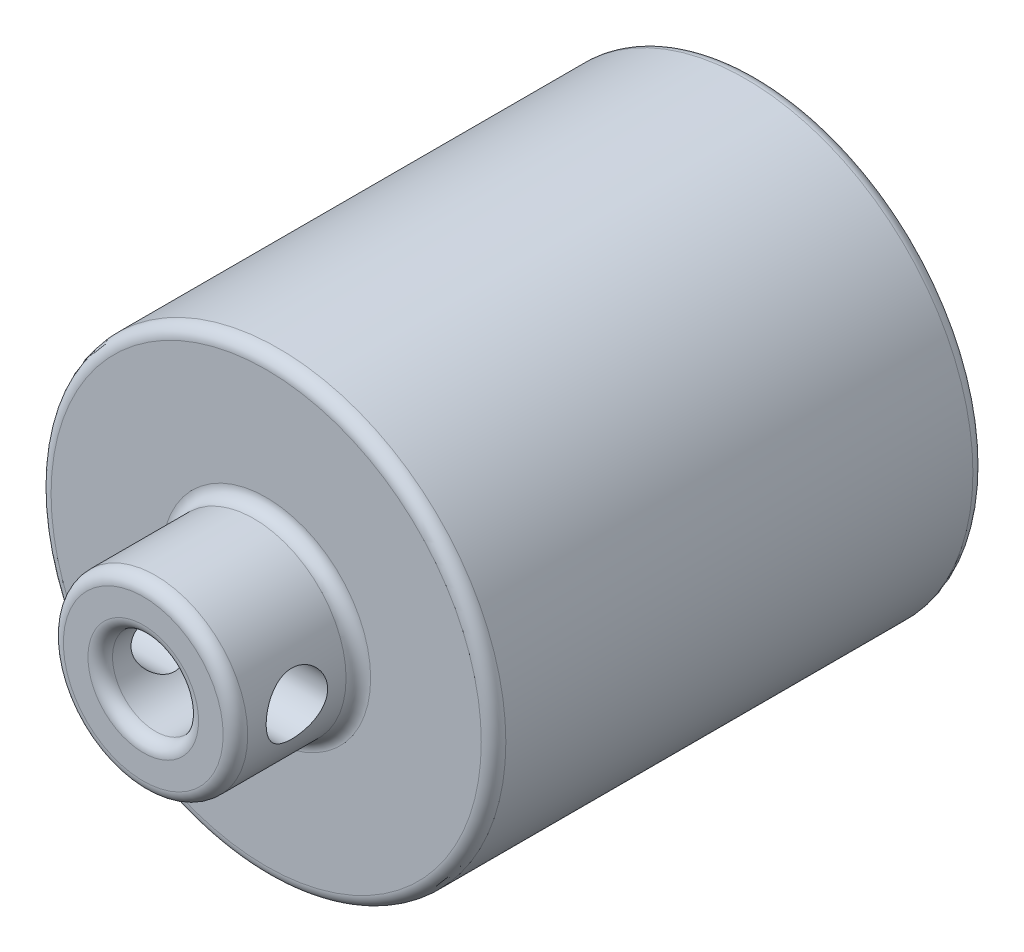
ISO-10303-21;
HEADER;
FILE_DESCRIPTION(('STEP AP214'),'2;1');
FILE_NAME('part.step','',(''),(''),'','','');
FILE_SCHEMA(('AUTOMOTIVE_DESIGN { 1 0 10303 214 1 1 1 1 }'));
ENDSEC;
DATA;
#1=APPLICATION_CONTEXT('core data for automotive mechanical design processes');
#2=APPLICATION_PROTOCOL_DEFINITION('international standard','automotive_design',2000,#1);
#3=PRODUCT_CONTEXT('',#1,'mechanical');
#4=PRODUCT('Part','Part','',(#3));
#5=PRODUCT_RELATED_PRODUCT_CATEGORY('part','',(#4));
#6=PRODUCT_DEFINITION_FORMATION('','',#4);
#7=PRODUCT_DEFINITION_CONTEXT('part definition',#1,'design');
#8=PRODUCT_DEFINITION('design','',#6,#7);
#9=PRODUCT_DEFINITION_SHAPE('','',#8);
#10=(LENGTH_UNIT() NAMED_UNIT(*) SI_UNIT(.MILLI.,.METRE.));
#11=(NAMED_UNIT(*) PLANE_ANGLE_UNIT() SI_UNIT($,.RADIAN.));
#12=(NAMED_UNIT(*) SI_UNIT($,.STERADIAN.) SOLID_ANGLE_UNIT());
#13=UNCERTAINTY_MEASURE_WITH_UNIT(LENGTH_MEASURE(1.E-05),#10,'distance_accuracy_value','');
#14=(GEOMETRIC_REPRESENTATION_CONTEXT(3) GLOBAL_UNCERTAINTY_ASSIGNED_CONTEXT((#13)) GLOBAL_UNIT_ASSIGNED_CONTEXT((#10,
#11,#12)) REPRESENTATION_CONTEXT('',''));
#15=CARTESIAN_POINT('',(0.,0.,0.));
#16=DIRECTION('',(0.,0.,1.));
#17=DIRECTION('',(1.,0.,0.));
#18=AXIS2_PLACEMENT_3D('',#15,#16,#17);
#19=CARTESIAN_POINT('',(0.,0.,40.));
#20=DIRECTION('',(0.,0.,-1.));
#21=DIRECTION('',(-1.,0.,0.));
#22=AXIS2_PLACEMENT_3D('',#19,#20,#21);
#23=CYLINDRICAL_SURFACE('',#22,18.5);
#24=CARTESIAN_POINT('',(0.,0.,1.));
#25=DIRECTION('',(0.,0.,1.));
#26=DIRECTION('',(1.,0.,0.));
#27=AXIS2_PLACEMENT_3D('',#24,#25,#26);
#28=CIRCLE('',#27,18.5);
#29=CARTESIAN_POINT('',(18.5,0.,1.));
#30=VERTEX_POINT('',#29);
#31=EDGE_CURVE('E141',#30,#30,#28,.T.);
#32=ORIENTED_EDGE('',*,*,#31,.T.);
#33=EDGE_LOOP('',(#32));
#34=FACE_BOUND('',#33,.T.);
#35=CARTESIAN_POINT('',(0.,0.,39.));
#36=DIRECTION('',(0.,0.,1.));
#37=DIRECTION('',(1.,0.,0.));
#38=AXIS2_PLACEMENT_3D('',#35,#36,#37);
#39=CIRCLE('',#38,18.5);
#40=CARTESIAN_POINT('',(18.5,0.,39.));
#41=VERTEX_POINT('',#40);
#42=EDGE_CURVE('E154',#41,#41,#39,.F.);
#43=ORIENTED_EDGE('',*,*,#42,.T.);
#44=EDGE_LOOP('',(#43));
#45=FACE_BOUND('',#44,.T.);
#46=ADVANCED_FACE('F43',(#34,#45),#23,.T.);
#47=CARTESIAN_POINT('',(0.,0.,40.));
#48=DIRECTION('',(0.,0.,1.));
#49=DIRECTION('',(1.,0.,0.));
#50=AXIS2_PLACEMENT_3D('',#47,#48,#49);
#51=PLANE('',#50);
#52=CARTESIAN_POINT('',(0.,0.,40.));
#53=DIRECTION('',(0.,0.,1.));
#54=DIRECTION('',(1.,0.,0.));
#55=AXIS2_PLACEMENT_3D('',#52,#53,#54);
#56=CIRCLE('',#55,8.5);
#57=CARTESIAN_POINT('',(8.5,0.,40.));
#58=VERTEX_POINT('',#57);
#59=EDGE_CURVE('E143',#58,#58,#56,.F.);
#60=ORIENTED_EDGE('',*,*,#59,.T.);
#61=EDGE_LOOP('',(#60));
#62=FACE_BOUND('',#61,.T.);
#63=CARTESIAN_POINT('',(0.,0.,40.));
#64=DIRECTION('',(0.,0.,1.));
#65=DIRECTION('',(1.,0.,0.));
#66=AXIS2_PLACEMENT_3D('',#63,#64,#65);
#67=CIRCLE('',#66,17.5);
#68=CARTESIAN_POINT('',(17.5,0.,40.));
#69=VERTEX_POINT('',#68);
#70=EDGE_CURVE('E158',#69,#69,#67,.T.);
#71=ORIENTED_EDGE('',*,*,#70,.T.);
#72=EDGE_LOOP('',(#71));
#73=FACE_BOUND('',#72,.T.);
#74=ADVANCED_FACE('F106',(#62,#73),#51,.T.);
#75=CARTESIAN_POINT('',(0.,0.,0.));
#76=DIRECTION('',(0.,0.,1.));
#77=DIRECTION('',(1.,0.,0.));
#78=AXIS2_PLACEMENT_3D('',#75,#76,#77);
#79=PLANE('',#78);
#80=CARTESIAN_POINT('',(0.,0.,0.));
#81=DIRECTION('',(0.,0.,1.));
#82=DIRECTION('',(1.,0.,0.));
#83=AXIS2_PLACEMENT_3D('',#80,#81,#82);
#84=CIRCLE('',#83,17.5);
#85=CARTESIAN_POINT('',(17.5,0.,0.));
#86=VERTEX_POINT('',#85);
#87=EDGE_CURVE('E63',#86,#86,#84,.F.);
#88=ORIENTED_EDGE('',*,*,#87,.T.);
#89=EDGE_LOOP('',(#88));
#90=FACE_BOUND('',#89,.T.);
#91=ADVANCED_FACE('F104',(#90),#79,.F.);
#92=CARTESIAN_POINT('',(0.,0.,50.));
#93=DIRECTION('',(0.,0.,-1.));
#94=DIRECTION('',(-1.,0.,0.));
#95=AXIS2_PLACEMENT_3D('',#92,#93,#94);
#96=CYLINDRICAL_SURFACE('',#95,7.5);
#97=CARTESIAN_POINT('',(-7.5,0.,47.5));
#98=CARTESIAN_POINT('',(-7.5000003825236,-0.136408407216808,47.5000006343291));
#99=CARTESIAN_POINT('',(-7.49624423768862,-0.272812986346374,47.488799334682));
#100=CARTESIAN_POINT('',(-7.48163025508202,-0.54160440218243,47.444427227957));
#101=CARTESIAN_POINT('',(-7.47077168005381,-0.673990820297045,47.4112541401277));
#102=CARTESIAN_POINT('',(-7.44313269766107,-0.93083197375444,47.3242018915399));
#103=CARTESIAN_POINT('',(-7.42636219327133,-1.05529956471509,47.2703573438518));
#104=CARTESIAN_POINT('',(-7.38861114293354,-1.29343734201331,47.1436470679041));
#105=CARTESIAN_POINT('',(-7.36762976669445,-1.40710539239676,47.0707775874935));
#106=CARTESIAN_POINT('',(-7.32285236107512,-1.62435418755567,46.9054354878531));
#107=CARTESIAN_POINT('',(-7.29898891159462,-1.72750925074578,46.8124219143488));
#108=CARTESIAN_POINT('',(-7.25150786957803,-1.91708173175521,46.6105821132336));
#109=CARTESIAN_POINT('',(-7.22789033226373,-2.00349546372366,46.5017524126787));
#110=CARTESIAN_POINT('',(-7.18283331193184,-2.15956235556965,46.2675372120089));
#111=CARTESIAN_POINT('',(-7.1614759818922,-2.22866214555258,46.1417656506697));
#112=CARTESIAN_POINT('',(-7.12438263546503,-2.3445471846943,45.8795597638536));
#113=CARTESIAN_POINT('',(-7.10864490401864,-2.39133924346691,45.7431287070931));
#114=CARTESIAN_POINT('',(-7.08528258173443,-2.45968365377291,45.4683169462582));
#115=CARTESIAN_POINT('',(-7.07740239424028,-2.48203362067942,45.3301569787773));
#116=CARTESIAN_POINT('',(-7.06989141573769,-2.5033528083362,45.0518406146103));
#117=CARTESIAN_POINT('',(-7.07025807556825,-2.5023292540118,44.911684848227));
#118=CARTESIAN_POINT('',(-7.0789753752045,-2.47754975925855,44.6401584238899));
#119=CARTESIAN_POINT('',(-7.08696039668832,-2.45483478291749,44.5086789927024));
#120=CARTESIAN_POINT('',(-7.10941644311377,-2.38901540712355,44.2515164509829));
#121=CARTESIAN_POINT('',(-7.12388824460269,-2.34590856647968,44.1258340364123));
#122=CARTESIAN_POINT('',(-7.15794777828122,-2.23984764515053,43.8814681260213));
#123=CARTESIAN_POINT('',(-7.17761414482793,-2.17658512176816,43.7629299363262));
#124=CARTESIAN_POINT('',(-7.21981396439316,-2.03222276575785,43.5378227293007));
#125=CARTESIAN_POINT('',(-7.24234824476159,-1.95111778091002,43.4312571826665));
#126=CARTESIAN_POINT('',(-7.28918322919352,-1.7683733317056,43.2272710045981));
#127=CARTESIAN_POINT('',(-7.31351473387107,-1.66588287519078,43.1306182637273));
#128=CARTESIAN_POINT('',(-7.36017345967592,-1.44584892492516,42.9556718333415));
#129=CARTESIAN_POINT('',(-7.38250048845168,-1.32830398915204,42.8773799045888));
#130=CARTESIAN_POINT('',(-7.42292769844484,-1.07986903261567,42.7407592494123));
#131=CARTESIAN_POINT('',(-7.44098375020098,-0.948858191040846,42.6826362716482));
#132=CARTESIAN_POINT('',(-7.47051417861087,-0.678172708411274,42.5894920651107));
#133=CARTESIAN_POINT('',(-7.48199084137198,-0.538501095387388,42.5544628114414));
#134=CARTESIAN_POINT('',(-7.49669067678601,-0.260959573823264,42.5098608349441));
#135=CARTESIAN_POINT('',(-7.5002500458432,-0.123273999662119,42.4992504770681));
#136=CARTESIAN_POINT('',(-7.49972256737068,0.15193767490059,42.5008316839962));
#137=CARTESIAN_POINT('',(-7.49563701048406,0.289463798299123,42.5130193999497));
#138=CARTESIAN_POINT('',(-7.48050061792761,0.556299665760637,42.5590297693399));
#139=CARTESIAN_POINT('',(-7.46965496777981,0.685732017087108,42.5922155151237));
#140=CARTESIAN_POINT('',(-7.44229617075175,0.937139896448933,42.6784836111668));
#141=CARTESIAN_POINT('',(-7.42578230116688,1.05911447127151,42.7315684986695));
#142=CARTESIAN_POINT('',(-7.38822328218224,1.29572074098318,42.857676079602));
#143=CARTESIAN_POINT('',(-7.36707036889465,1.41007489804287,42.9311864832079));
#144=CARTESIAN_POINT('',(-7.32263134790656,1.62516207533897,43.0954853750337));
#145=CARTESIAN_POINT('',(-7.29934458984569,1.72589091948894,43.1862791400794));
#146=CARTESIAN_POINT('',(-7.25192119951112,1.91563126951575,43.3874468775165));
#147=CARTESIAN_POINT('',(-7.2277940271857,2.00390242311443,43.4985230673172));
#148=CARTESIAN_POINT('',(-7.18249933236772,2.16064380580894,43.7344289195272));
#149=CARTESIAN_POINT('',(-7.16133183455006,2.22911386982754,43.8592586965852));
#150=CARTESIAN_POINT('',(-7.12455979478459,2.3439923260409,44.1191825382247));
#151=CARTESIAN_POINT('',(-7.10894401982447,2.39044533041255,44.2542551979219));
#152=CARTESIAN_POINT('',(-7.08527080766124,2.45973666689839,44.5309466251103));
#153=CARTESIAN_POINT('',(-7.07720996559098,2.48258563738485,44.6725624135109));
#154=CARTESIAN_POINT('',(-7.06994647185443,2.50319070619336,44.9504927401023));
#155=CARTESIAN_POINT('',(-7.07031000643538,2.502175643271,45.0867058507171));
#156=CARTESIAN_POINT('',(-7.07878174559668,2.47810573362174,45.3569126873052));
#157=CARTESIAN_POINT('',(-7.08688948923404,2.45505219864647,45.4909065448877));
#158=CARTESIAN_POINT('',(-7.10961310762229,2.38842953282336,45.7503391575062));
#159=CARTESIAN_POINT('',(-7.12410245056194,2.34525836503879,45.8758920625112));
#160=CARTESIAN_POINT('',(-7.15790997046171,2.23994841439937,46.1180685173457));
#161=CARTESIAN_POINT('',(-7.17722921908483,2.17780542138452,46.23469007797));
#162=CARTESIAN_POINT('',(-7.21957073065115,2.03315173145858,46.4612091748073));
#163=CARTESIAN_POINT('',(-7.24271779105343,1.94987060691145,46.570591254746));
#164=CARTESIAN_POINT('',(-7.28958390708132,1.76660720783912,46.7742245334605));
#165=CARTESIAN_POINT('',(-7.31330312280931,1.66662021112871,46.8684714392202));
#166=CARTESIAN_POINT('',(-7.3597507631386,1.44810389230173,47.0428610307229));
#167=CARTESIAN_POINT('',(-7.38240454503142,1.32900378374932,47.1223108693775));
#168=CARTESIAN_POINT('',(-7.4231497793153,1.07839339351656,47.2599760721266));
#169=CARTESIAN_POINT('',(-7.44124239769824,0.946886295330872,47.3181968648051));
#170=CARTESIAN_POINT('',(-7.47013787671354,0.681234118002439,47.4093040812217));
#171=CARTESIAN_POINT('',(-7.48123031056307,0.547469394191021,47.4432061656584));
#172=CARTESIAN_POINT('',(-7.49616017660555,0.275801040025617,47.4885507016928));
#173=CARTESIAN_POINT('',(-7.49999961329762,0.137898563921866,47.4999993587413));
#174=CARTESIAN_POINT('',(-7.5,0.,47.5));
#175=B_SPLINE_CURVE_WITH_KNOTS('',3,(#97,#98,#99,#100,#101,#102,#103,#104,#105,#106,#107,#108,
#109,#110,#111,#112,#113,#114,#115,#116,#117,#118,#119,#120,#121,#122,#123,#124,#125,#126,#127,
#128,#129,#130,#131,#132,#133,#134,#135,#136,#137,#138,#139,#140,#141,#142,#143,#144,#145,#146,
#147,#148,#149,#150,#151,#152,#153,#154,#155,#156,#157,#158,#159,#160,#161,#162,#163,#164,#165,
#166,#167,#168,#169,#170,#171,#172,#173,#174),.UNSPECIFIED.,.T.,.F.,(4,2,2,2,2,2,2,2,2,2,2,2,2,
2,2,2,2,2,2,2,2,2,2,2,2,2,2,2,2,2,2,2,2,2,2,2,2,2,4),(0.,0.408717765065027,0.817477963168801,
1.22555668217569,1.63371594449775,2.0546171070689,2.47561083218826,2.90870962058676,
3.34167611732083,3.760048143546,4.17829084968714,4.57742066378201,4.97659827138705,
5.38220427887826,5.78792756395518,6.21483264528417,6.64177864916546,7.07296014125894,
7.50399172193021,7.91633957937924,8.32861782910442,8.72895394945534,9.1293411321026,
9.54025999609342,9.95130452054729,10.3810255720188,10.8107502058749,11.2396003456693,
11.668257117646,12.0748916516065,12.4815019837844,12.8803896770104,13.2793659543994,
13.6957516672951,14.1122552780945,14.5449915208775,14.9776170288114,15.3909139593454,
15.8040966509535),.UNSPECIFIED.);
#176=CARTESIAN_POINT('',(-7.5,0.,47.5));
#177=VERTEX_POINT('',#176);
#178=EDGE_CURVE('E94',#177,#177,#175,.T.);
#179=ORIENTED_EDGE('',*,*,#178,.T.);
#180=EDGE_LOOP('',(#179));
#181=FACE_BOUND('',#180,.T.);
#182=CARTESIAN_POINT('',(7.5,0.,42.5));
#183=CARTESIAN_POINT('',(7.5000003825236,-0.136408407216808,42.4999993656709));
#184=CARTESIAN_POINT('',(7.49624423768862,-0.272812986346374,42.511200665318));
#185=CARTESIAN_POINT('',(7.48163025508202,-0.54160440218243,42.555572772043));
#186=CARTESIAN_POINT('',(7.47077168005381,-0.673990820297045,42.5887458598723));
#187=CARTESIAN_POINT('',(7.44313269766107,-0.93083197375444,42.6757981084601));
#188=CARTESIAN_POINT('',(7.42636219327133,-1.05529956471509,42.7296426561482));
#189=CARTESIAN_POINT('',(7.38861114293354,-1.29343734201331,42.8563529320959));
#190=CARTESIAN_POINT('',(7.36762976669445,-1.40710539239676,42.9292224125065));
#191=CARTESIAN_POINT('',(7.32285236107512,-1.62435418755567,43.0945645121469));
#192=CARTESIAN_POINT('',(7.29898891159462,-1.72750925074578,43.1875780856512));
#193=CARTESIAN_POINT('',(7.25150786957803,-1.91708173175521,43.3894178867664));
#194=CARTESIAN_POINT('',(7.22789033226373,-2.00349546372366,43.4982475873213));
#195=CARTESIAN_POINT('',(7.18283331193184,-2.15956235556965,43.7324627879911));
#196=CARTESIAN_POINT('',(7.1614759818922,-2.22866214555258,43.8582343493303));
#197=CARTESIAN_POINT('',(7.12438263546503,-2.3445471846943,44.1204402361464));
#198=CARTESIAN_POINT('',(7.10864490401864,-2.39133924346691,44.2568712929069));
#199=CARTESIAN_POINT('',(7.08528258173443,-2.45968365377291,44.5316830537418));
#200=CARTESIAN_POINT('',(7.07740239424028,-2.48203362067943,44.6698430212227));
#201=CARTESIAN_POINT('',(7.06989141573769,-2.5033528083362,44.9481593853897));
#202=CARTESIAN_POINT('',(7.07025807556825,-2.5023292540118,45.088315151773));
#203=CARTESIAN_POINT('',(7.0789753752045,-2.47754975925855,45.3598415761101));
#204=CARTESIAN_POINT('',(7.08696039668832,-2.45483478291749,45.4913210072975));
#205=CARTESIAN_POINT('',(7.10941644311377,-2.38901540712355,45.7484835490171));
#206=CARTESIAN_POINT('',(7.12388824460269,-2.34590856647968,45.8741659635877));
#207=CARTESIAN_POINT('',(7.15794777828122,-2.23984764515053,46.1185318739787));
#208=CARTESIAN_POINT('',(7.17761414482793,-2.17658512176816,46.2370700636738));
#209=CARTESIAN_POINT('',(7.21981396439316,-2.03222276575785,46.4621772706993));
#210=CARTESIAN_POINT('',(7.24234824476159,-1.95111778091002,46.5687428173334));
#211=CARTESIAN_POINT('',(7.28918322919352,-1.7683733317056,46.7727289954019));
#212=CARTESIAN_POINT('',(7.31351473387107,-1.66588287519078,46.8693817362727));
#213=CARTESIAN_POINT('',(7.36017345967592,-1.44584892492516,47.0443281666585));
#214=CARTESIAN_POINT('',(7.38250048845168,-1.32830398915204,47.1226200954112));
#215=CARTESIAN_POINT('',(7.42292769844484,-1.07986903261567,47.2592407505877));
#216=CARTESIAN_POINT('',(7.44098375020098,-0.948858191040846,47.3173637283518));
#217=CARTESIAN_POINT('',(7.47051417861087,-0.678172708411274,47.4105079348893));
#218=CARTESIAN_POINT('',(7.48199084137198,-0.538501095387388,47.4455371885586));
#219=CARTESIAN_POINT('',(7.49669067678601,-0.260959573823264,47.4901391650559));
#220=CARTESIAN_POINT('',(7.5002500458432,-0.123273999662119,47.5007495229319));
#221=CARTESIAN_POINT('',(7.49972256737068,0.15193767490059,47.4991683160038));
#222=CARTESIAN_POINT('',(7.49563701048406,0.289463798299123,47.4869806000503));
#223=CARTESIAN_POINT('',(7.48050061792761,0.556299665760637,47.4409702306601));
#224=CARTESIAN_POINT('',(7.46965496777981,0.685732017087108,47.4077844848763));
#225=CARTESIAN_POINT('',(7.44229617075175,0.937139896448933,47.3215163888332));
#226=CARTESIAN_POINT('',(7.42578230116688,1.05911447127151,47.2684315013305));
#227=CARTESIAN_POINT('',(7.38822328218224,1.29572074098318,47.142323920398));
#228=CARTESIAN_POINT('',(7.36707036889465,1.41007489804287,47.0688135167921));
#229=CARTESIAN_POINT('',(7.32263134790656,1.62516207533897,46.9045146249663));
#230=CARTESIAN_POINT('',(7.29934458984569,1.72589091948894,46.8137208599206));
#231=CARTESIAN_POINT('',(7.25192119951112,1.91563126951575,46.6125531224835));
#232=CARTESIAN_POINT('',(7.2277940271857,2.00390242311443,46.5014769326828));
#233=CARTESIAN_POINT('',(7.18249933236772,2.16064380580894,46.2655710804728));
#234=CARTESIAN_POINT('',(7.16133183455006,2.22911386982754,46.1407413034148));
#235=CARTESIAN_POINT('',(7.12455979478459,2.34399232604091,45.8808174617753));
#236=CARTESIAN_POINT('',(7.10894401982447,2.39044533041255,45.7457448020781));
#237=CARTESIAN_POINT('',(7.08527080766124,2.45973666689839,45.4690533748897));
#238=CARTESIAN_POINT('',(7.07720996559098,2.48258563738485,45.3274375864891));
#239=CARTESIAN_POINT('',(7.06994647185443,2.50319070619336,45.0495072598977));
#240=CARTESIAN_POINT('',(7.07031000643538,2.502175643271,44.9132941492829));
#241=CARTESIAN_POINT('',(7.07878174559668,2.47810573362174,44.6430873126948));
#242=CARTESIAN_POINT('',(7.08688948923404,2.45505219864647,44.5090934551123));
#243=CARTESIAN_POINT('',(7.10961310762229,2.38842953282336,44.2496608424938));
#244=CARTESIAN_POINT('',(7.12410245056194,2.34525836503879,44.1241079374888));
#245=CARTESIAN_POINT('',(7.15790997046171,2.23994841439937,43.8819314826543));
#246=CARTESIAN_POINT('',(7.17722921908483,2.17780542138452,43.76530992203));
#247=CARTESIAN_POINT('',(7.21957073065115,2.03315173145858,43.5387908251927));
#248=CARTESIAN_POINT('',(7.24271779105342,1.94987060691146,43.429408745254));
#249=CARTESIAN_POINT('',(7.28958390708132,1.76660720783913,43.2257754665395));
#250=CARTESIAN_POINT('',(7.3133031228093,1.66662021112871,43.1315285607798));
#251=CARTESIAN_POINT('',(7.3597507631386,1.44810389230173,42.9571389692771));
#252=CARTESIAN_POINT('',(7.38240454503142,1.32900378374932,42.8776891306225));
#253=CARTESIAN_POINT('',(7.4231497793153,1.07839339351656,42.7400239278734));
#254=CARTESIAN_POINT('',(7.44124239769824,0.946886295330872,42.6818031351949));
#255=CARTESIAN_POINT('',(7.47013787671354,0.681234118002439,42.5906959187783));
#256=CARTESIAN_POINT('',(7.48123031056307,0.547469394191021,42.5567938343415));
#257=CARTESIAN_POINT('',(7.49616017660555,0.275801040025617,42.5114492983072));
#258=CARTESIAN_POINT('',(7.49999961329762,0.137898563921866,42.5000006412587));
#259=CARTESIAN_POINT('',(7.5,0.,42.5));
#260=B_SPLINE_CURVE_WITH_KNOTS('',3,(#182,#183,#184,#185,#186,#187,#188,#189,#190,#191,#192,
#193,#194,#195,#196,#197,#198,#199,#200,#201,#202,#203,#204,#205,#206,#207,#208,#209,#210,#211,
#212,#213,#214,#215,#216,#217,#218,#219,#220,#221,#222,#223,#224,#225,#226,#227,#228,#229,#230,
#231,#232,#233,#234,#235,#236,#237,#238,#239,#240,#241,#242,#243,#244,#245,#246,#247,#248,#249,
#250,#251,#252,#253,#254,#255,#256,#257,#258,#259),.UNSPECIFIED.,.T.,.F.,(4,2,2,2,2,2,2,2,2,2,2,
2,2,2,2,2,2,2,2,2,2,2,2,2,2,2,2,2,2,2,2,2,2,2,2,2,2,2,4),(0.,0.408717765065027,
0.817477963168801,1.22555668217569,1.63371594449775,2.0546171070689,2.47561083218826,
2.90870962058676,3.34167611732083,3.76004814354601,4.17829084968714,4.57742066378201,
4.97659827138705,5.38220427887826,5.78792756395518,6.21483264528417,6.64177864916546,
7.07296014125894,7.50399172193021,7.91633957937924,8.32861782910442,8.72895394945534,
9.1293411321026,9.54025999609342,9.95130452054729,10.3810255720188,10.8107502058749,
11.2396003456693,11.668257117646,12.0748916516065,12.4815019837844,12.8803896770104,
13.2793659543994,13.6957516672951,14.1122552780945,14.5449915208775,14.9776170288114,
15.3909139593454,15.8040966509535),.UNSPECIFIED.);
#261=CARTESIAN_POINT('',(7.5,0.,42.5));
#262=VERTEX_POINT('',#261);
#263=EDGE_CURVE('E87',#262,#262,#260,.T.);
#264=ORIENTED_EDGE('',*,*,#263,.T.);
#265=EDGE_LOOP('',(#264));
#266=FACE_BOUND('',#265,.T.);
#267=CARTESIAN_POINT('',(0.,0.,41.));
#268=DIRECTION('',(0.,0.,1.));
#269=DIRECTION('',(1.,0.,0.));
#270=AXIS2_PLACEMENT_3D('',#267,#268,#269);
#271=CIRCLE('',#270,7.5);
#272=CARTESIAN_POINT('',(7.5,0.,41.));
#273=VERTEX_POINT('',#272);
#274=EDGE_CURVE('E148',#273,#273,#271,.T.);
#275=ORIENTED_EDGE('',*,*,#274,.T.);
#276=EDGE_LOOP('',(#275));
#277=FACE_BOUND('',#276,.T.);
#278=CARTESIAN_POINT('',(0.,0.,49.));
#279=DIRECTION('',(0.,0.,1.));
#280=DIRECTION('',(1.,0.,0.));
#281=AXIS2_PLACEMENT_3D('',#278,#279,#280);
#282=CIRCLE('',#281,7.5);
#283=CARTESIAN_POINT('',(7.5,0.,49.));
#284=VERTEX_POINT('',#283);
#285=EDGE_CURVE('E162',#284,#284,#282,.F.);
#286=ORIENTED_EDGE('',*,*,#285,.T.);
#287=EDGE_LOOP('',(#286));
#288=FACE_BOUND('',#287,.T.);
#289=ADVANCED_FACE('F99',(#181,#266,#277,#288),#96,.T.);
#290=CARTESIAN_POINT('',(0.,0.,50.));
#291=DIRECTION('',(0.,0.,1.));
#292=DIRECTION('',(1.,0.,0.));
#293=AXIS2_PLACEMENT_3D('',#290,#291,#292);
#294=PLANE('',#293);
#295=CARTESIAN_POINT('',(0.,0.,50.));
#296=DIRECTION('',(0.,0.,1.));
#297=DIRECTION('',(1.,0.,0.));
#298=AXIS2_PLACEMENT_3D('',#295,#296,#297);
#299=CIRCLE('',#298,4.5);
#300=CARTESIAN_POINT('',(4.5,0.,50.));
#301=VERTEX_POINT('',#300);
#302=EDGE_CURVE('E10',#301,#301,#299,.F.);
#303=ORIENTED_EDGE('',*,*,#302,.T.);
#304=EDGE_LOOP('',(#303));
#305=FACE_BOUND('',#304,.T.);
#306=CARTESIAN_POINT('',(0.,0.,50.));
#307=DIRECTION('',(0.,0.,1.));
#308=DIRECTION('',(1.,0.,0.));
#309=AXIS2_PLACEMENT_3D('',#306,#307,#308);
#310=CIRCLE('',#309,6.5);
#311=CARTESIAN_POINT('',(6.5,0.,50.));
#312=VERTEX_POINT('',#311);
#313=EDGE_CURVE('E166',#312,#312,#310,.T.);
#314=ORIENTED_EDGE('',*,*,#313,.T.);
#315=EDGE_LOOP('',(#314));
#316=FACE_BOUND('',#315,.T.);
#317=ADVANCED_FACE('F103',(#305,#316),#294,.T.);
#318=CARTESIAN_POINT('',(0.,0.,18.));
#319=DIRECTION('',(0.,0.,1.));
#320=DIRECTION('',(1.,0.,0.));
#321=AXIS2_PLACEMENT_3D('',#318,#319,#320);
#322=CYLINDRICAL_SURFACE('',#321,3.5);
#323=CARTESIAN_POINT('',(3.5,0.,42.5));
#324=CARTESIAN_POINT('',(3.50000063992499,0.123728813191222,42.4999995172946));
#325=CARTESIAN_POINT('',(3.4933837716556,0.247452607509518,42.5092379131913));
#326=CARTESIAN_POINT('',(3.46756729775865,0.49089705696688,42.5455785930129));
#327=CARTESIAN_POINT('',(3.44836221741437,0.61061594651881,42.5726886494991));
#328=CARTESIAN_POINT('',(3.39922983630841,0.842134278979704,42.6430123450369));
#329=CARTESIAN_POINT('',(3.3693562097146,0.953970069083478,42.6861454141439));
#330=CARTESIAN_POINT('',(3.30119473506673,1.16823399696302,42.7865761642422));
#331=CARTESIAN_POINT('',(3.26290575998324,1.27066087203771,42.8438757426183));
#332=CARTESIAN_POINT('',(3.17674762370411,1.4735973979734,42.9765122661982));
#333=CARTESIAN_POINT('',(3.12832735809472,1.57311214719791,43.0530056630126));
#334=CARTESIAN_POINT('',(3.02784542835155,1.75878471370039,43.2189300441151));
#335=CARTESIAN_POINT('',(2.97577837204529,1.84492211922789,43.3083804045214));
#336=CARTESIAN_POINT('',(2.86208795270916,2.01766896264091,43.5165731036106));
#337=CARTESIAN_POINT('',(2.80046815480895,2.10145177248818,43.637677057749));
#338=CARTESIAN_POINT('',(2.68458125505734,2.2475978969173,43.8953881695153));
#339=CARTESIAN_POINT('',(2.63030251861165,2.30999535105659,44.0319701497454));
#340=CARTESIAN_POINT('',(2.55341938550326,2.39420227525008,44.2730591943005));
#341=CARTESIAN_POINT('',(2.52624076170168,2.42261104159712,44.3737835002019));
#342=CARTESIAN_POINT('',(2.48316150088381,2.46675383593693,44.5802187664236));
#343=CARTESIAN_POINT('',(2.46723695421588,2.48251474443333,44.6859186429313));
#344=CARTESIAN_POINT('',(2.44917774353951,2.50034254973894,44.9003986360956));
#345=CARTESIAN_POINT('',(2.44713265311551,2.5023204979036,45.0091942187925));
#346=CARTESIAN_POINT('',(2.45746365754183,2.49216996728832,45.2254651707678));
#347=CARTESIAN_POINT('',(2.46985166511363,2.48002983581059,45.3329393753807));
#348=CARTESIAN_POINT('',(2.50924006406179,2.44019893993843,45.5567457237406));
#349=CARTESIAN_POINT('',(2.53790670458073,2.41071787181293,45.6724527341761));
#350=CARTESIAN_POINT('',(2.60595426548788,2.33698623060057,45.8957647289511));
#351=CARTESIAN_POINT('',(2.64535889377607,2.29270292673418,46.0033511048775));
#352=CARTESIAN_POINT('',(2.74335980257751,2.17519571376576,46.2414559993852));
#353=CARTESIAN_POINT('',(2.80411912140021,2.09725595934503,46.3687478657055));
#354=CARTESIAN_POINT('',(2.92782316656875,1.92080796250095,46.6070146153866));
#355=CARTESIAN_POINT('',(2.99076998991497,1.8222795028826,46.7179732763547));
#356=CARTESIAN_POINT('',(3.11300197414729,1.60466805722388,46.9229101709285));
#357=CARTESIAN_POINT('',(3.17224499078237,1.48539228396116,47.0167105006421));
#358=CARTESIAN_POINT('',(3.28024169483456,1.22853771239817,47.1826447444905));
#359=CARTESIAN_POINT('',(3.3290193121385,1.09100185946154,47.2548282400728));
#360=CARTESIAN_POINT('',(3.40005921099989,0.837977937487213,47.3582651901909));
#361=CARTESIAN_POINT('',(3.42591205063844,0.725838222288039,47.3952643805006));
#362=CARTESIAN_POINT('',(3.46670277833946,0.495579346511688,47.4532548955223));
#363=CARTESIAN_POINT('',(3.48164859772487,0.37746459780427,47.4742578527966));
#364=CARTESIAN_POINT('',(3.49933682658195,0.138134688429553,47.4990868466538));
#365=CARTESIAN_POINT('',(3.50204052258512,0.0169109096295163,47.5028583923991));
#366=CARTESIAN_POINT('',(3.49488258408794,-0.224436907512674,47.4928330472801));
#367=CARTESIAN_POINT('',(3.48501961477188,-0.344560827664084,47.4790342901199));
#368=CARTESIAN_POINT('',(3.45439685890596,-0.574421637419475,47.4357904269286));
#369=CARTESIAN_POINT('',(3.43417853507596,-0.684380739703792,47.4071219637829));
#370=CARTESIAN_POINT('',(3.38472449846573,-0.897567876620168,47.3360245214443));
#371=CARTESIAN_POINT('',(3.35548695698345,-1.0007945410623,47.2935927515662));
#372=CARTESIAN_POINT('',(3.28693977419553,-1.20788320476995,47.192145117686));
#373=CARTESIAN_POINT('',(3.2469564625953,-1.31095115376591,47.1319729233015));
#374=CARTESIAN_POINT('',(3.16124256132459,-1.50595944144951,46.9990093726765));
#375=CARTESIAN_POINT('',(3.11550752347251,-1.59789105848437,46.926208232945));
#376=CARTESIAN_POINT('',(3.01253197752163,-1.78551589650357,46.7552324583349));
#377=CARTESIAN_POINT('',(2.95470727969555,-1.87887834330757,46.6548502540851));
#378=CARTESIAN_POINT('',(2.83988174609794,-2.04830105316356,46.4398649187935));
#379=CARTESIAN_POINT('',(2.78288136485279,-2.12435208766382,46.3252542527655));
#380=CARTESIAN_POINT('',(2.68415113950394,-2.24734426464111,46.1014171011748));
#381=CARTESIAN_POINT('',(2.64142413683914,-2.29697109549402,45.9941138549026));
#382=CARTESIAN_POINT('',(2.56570672982984,-2.38125378942134,45.7705992017416));
#383=CARTESIAN_POINT('',(2.53269577575559,-2.41594132264732,45.6544072605909));
#384=CARTESIAN_POINT('',(2.48640569092986,-2.4634705571157,45.4373178559453));
#385=CARTESIAN_POINT('',(2.47059656839565,-2.47917783706206,45.3376026066063));
#386=CARTESIAN_POINT('',(2.45120901302806,-2.49835466240567,45.1358636273157));
#387=CARTESIAN_POINT('',(2.44761694614491,-2.50183784984414,45.0338425987099));
#388=CARTESIAN_POINT('',(2.45324019333315,-2.49632174120909,44.8305082099505));
#389=CARTESIAN_POINT('',(2.46245637461117,-2.48732159992832,44.729194898181));
#390=CARTESIAN_POINT('',(2.49221948479094,-2.45749256006836,44.5299859466431));
#391=CARTESIAN_POINT('',(2.51278394118372,-2.43664536213886,44.4320958433706));
#392=CARTESIAN_POINT('',(2.570997906227,-2.37535009925765,44.2092929224818));
#393=CARTESIAN_POINT('',(2.61207539816555,-2.33065409759394,44.0864620133631));
#394=CARTESIAN_POINT('',(2.70305072969478,-2.2245005903241,43.8518479073246));
#395=CARTESIAN_POINT('',(2.75296318217849,-2.16301522249271,43.7400834993134));
#396=CARTESIAN_POINT('',(2.85755496874116,-2.02292450312533,43.5253381090418));
#397=CARTESIAN_POINT('',(2.91232641309571,-1.9439031266655,43.4226742627679));
#398=CARTESIAN_POINT('',(3.0207903556272,-1.7706796808322,43.2304055733755));
#399=CARTESIAN_POINT('',(3.07448247590879,-1.67647239517768,43.1408052377182));
#400=CARTESIAN_POINT('',(3.18556467553451,-1.45596509730887,42.9619760473931));
#401=CARTESIAN_POINT('',(3.2420137232047,-1.32693197804408,42.8754378483413));
#402=CARTESIAN_POINT('',(3.31667944446703,-1.12028117539184,42.763683485957));
#403=CARTESIAN_POINT('',(3.33989867907087,-1.04921986546207,42.7294427428239));
#404=CARTESIAN_POINT('',(3.3823153915786,-0.903173022827902,42.6674971870075));
#405=CARTESIAN_POINT('',(3.40151442917424,-0.828189026148807,42.6397898390739));
#406=CARTESIAN_POINT('',(3.44466177853936,-0.631868635659949,42.5779270238415));
#407=CARTESIAN_POINT('',(3.46524216632152,-0.508104933005464,42.5488594644622));
#408=CARTESIAN_POINT('',(3.49290436679927,-0.256222780653931,42.5099055510979));
#409=CARTESIAN_POINT('',(3.49999933742225,-0.128108700082425,42.5000004997927));
#410=CARTESIAN_POINT('',(3.5,0.,42.5));
#411=B_SPLINE_CURVE_WITH_KNOTS('',3,(#323,#324,#325,#326,#327,#328,#329,#330,#331,#332,#333,
#334,#335,#336,#337,#338,#339,#340,#341,#342,#343,#344,#345,#346,#347,#348,#349,#350,#351,#352,
#353,#354,#355,#356,#357,#358,#359,#360,#361,#362,#363,#364,#365,#366,#367,#368,#369,#370,#371,
#372,#373,#374,#375,#376,#377,#378,#379,#380,#381,#382,#383,#384,#385,#386,#387,#388,#389,#390,
#391,#392,#393,#394,#395,#396,#397,#398,#399,#400,#401,#402,#403,#404,#405,#406,#407,#408,#409,
#410),.UNSPECIFIED.,.T.,.F.,(4,2,2,2,2,2,2,2,2,2,2,2,2,2,2,2,2,2,2,2,2,2,2,2,2,2,2,2,2,2,2,2,2,
2,2,2,2,2,2,2,2,2,2,4),(0.,0.370678561722371,0.741518441654505,1.11051829384682,
1.47956759466008,1.88169861959201,2.28443732992832,2.76124402205304,3.2372859558121,
3.56047339006296,3.88297212103196,4.20755019318242,4.53239635392984,4.89878958243804,
5.26599840083146,5.74701313668846,6.22850244615395,6.71473144065692,7.19983650067096,
7.56096516289941,7.92183095866113,8.28383713289182,8.64588176217871,8.99068000299141,
9.33554819977726,9.71174322226927,10.0882309906957,10.5328611675572,10.9777278203748,
11.3535772201857,11.728625878901,12.0338187619671,12.3386709424267,12.6435437644843,
12.9488887880462,13.3576912734812,13.7671763401183,14.1876762226839,14.6083208537776,
15.1009923405612,15.3472912000445,15.5934943266635,15.9776696091468,16.3614698531311),.UNSPECIFIED.);
#412=CARTESIAN_POINT('',(3.5,0.,42.5));
#413=VERTEX_POINT('',#412);
#414=EDGE_CURVE('E47',#413,#413,#411,.T.);
#415=ORIENTED_EDGE('',*,*,#414,.T.);
#416=EDGE_LOOP('',(#415));
#417=FACE_BOUND('',#416,.T.);
#418=CARTESIAN_POINT('',(-3.5,0.,42.5));
#419=CARTESIAN_POINT('',(-3.50000063992499,-0.123728813191222,42.4999995172946));
#420=CARTESIAN_POINT('',(-3.4933837716556,-0.247452607509518,42.5092379131913));
#421=CARTESIAN_POINT('',(-3.46756729775865,-0.49089705696688,42.5455785930129));
#422=CARTESIAN_POINT('',(-3.44836221741437,-0.61061594651881,42.5726886494991));
#423=CARTESIAN_POINT('',(-3.39922983630841,-0.842134278979704,42.6430123450369));
#424=CARTESIAN_POINT('',(-3.3693562097146,-0.953970069083478,42.6861454141439));
#425=CARTESIAN_POINT('',(-3.30119473506673,-1.16823399696302,42.7865761642422));
#426=CARTESIAN_POINT('',(-3.26290575998324,-1.27066087203771,42.8438757426183));
#427=CARTESIAN_POINT('',(-3.17674762370411,-1.4735973979734,42.9765122661982));
#428=CARTESIAN_POINT('',(-3.12832735809472,-1.57311214719791,43.0530056630126));
#429=CARTESIAN_POINT('',(-3.02784542835155,-1.75878471370039,43.2189300441151));
#430=CARTESIAN_POINT('',(-2.97577837204529,-1.84492211922789,43.3083804045214));
#431=CARTESIAN_POINT('',(-2.86208795270916,-2.01766896264091,43.5165731036106));
#432=CARTESIAN_POINT('',(-2.80046815480895,-2.10145177248818,43.637677057749));
#433=CARTESIAN_POINT('',(-2.68458125505734,-2.2475978969173,43.8953881695153));
#434=CARTESIAN_POINT('',(-2.63030251861165,-2.30999535105659,44.0319701497454));
#435=CARTESIAN_POINT('',(-2.55341938550326,-2.39420227525008,44.2730591943005));
#436=CARTESIAN_POINT('',(-2.52624076170168,-2.42261104159712,44.3737835002019));
#437=CARTESIAN_POINT('',(-2.48316150088381,-2.46675383593693,44.5802187664236));
#438=CARTESIAN_POINT('',(-2.46723695421588,-2.48251474443333,44.6859186429313));
#439=CARTESIAN_POINT('',(-2.44917774353951,-2.50034254973894,44.9003986360956));
#440=CARTESIAN_POINT('',(-2.44713265311551,-2.5023204979036,45.0091942187925));
#441=CARTESIAN_POINT('',(-2.45746365754183,-2.49216996728832,45.2254651707678));
#442=CARTESIAN_POINT('',(-2.46985166511363,-2.48002983581059,45.3329393753807));
#443=CARTESIAN_POINT('',(-2.50924006406179,-2.44019893993843,45.5567457237406));
#444=CARTESIAN_POINT('',(-2.53790670458073,-2.41071787181293,45.6724527341761));
#445=CARTESIAN_POINT('',(-2.60595426548788,-2.33698623060057,45.8957647289511));
#446=CARTESIAN_POINT('',(-2.64535889377607,-2.29270292673418,46.0033511048775));
#447=CARTESIAN_POINT('',(-2.74335980257751,-2.17519571376576,46.2414559993852));
#448=CARTESIAN_POINT('',(-2.80411912140021,-2.09725595934503,46.3687478657055));
#449=CARTESIAN_POINT('',(-2.92782316656875,-1.92080796250095,46.6070146153866));
#450=CARTESIAN_POINT('',(-2.99076998991497,-1.8222795028826,46.7179732763547));
#451=CARTESIAN_POINT('',(-3.11300197414729,-1.60466805722388,46.9229101709285));
#452=CARTESIAN_POINT('',(-3.17224499078237,-1.48539228396116,47.0167105006421));
#453=CARTESIAN_POINT('',(-3.28024169483456,-1.22853771239817,47.1826447444905));
#454=CARTESIAN_POINT('',(-3.3290193121385,-1.09100185946154,47.2548282400728));
#455=CARTESIAN_POINT('',(-3.40005921099989,-0.837977937487213,47.3582651901909));
#456=CARTESIAN_POINT('',(-3.42591205063844,-0.725838222288039,47.3952643805006));
#457=CARTESIAN_POINT('',(-3.46670277833946,-0.495579346511688,47.4532548955223));
#458=CARTESIAN_POINT('',(-3.48164859772487,-0.37746459780427,47.4742578527966));
#459=CARTESIAN_POINT('',(-3.49933682658195,-0.138134688429553,47.4990868466538));
#460=CARTESIAN_POINT('',(-3.50204052258512,-0.0169109096295163,47.5028583923991));
#461=CARTESIAN_POINT('',(-3.49488258408794,0.224436907512674,47.4928330472801));
#462=CARTESIAN_POINT('',(-3.48501961477188,0.344560827664084,47.4790342901199));
#463=CARTESIAN_POINT('',(-3.45439685890596,0.574421637419475,47.4357904269286));
#464=CARTESIAN_POINT('',(-3.43417853507596,0.684380739703792,47.4071219637829));
#465=CARTESIAN_POINT('',(-3.38472449846573,0.897567876620168,47.3360245214443));
#466=CARTESIAN_POINT('',(-3.35548695698345,1.0007945410623,47.2935927515662));
#467=CARTESIAN_POINT('',(-3.28693977419553,1.20788320476995,47.192145117686));
#468=CARTESIAN_POINT('',(-3.2469564625953,1.31095115376591,47.1319729233015));
#469=CARTESIAN_POINT('',(-3.16124256132459,1.50595944144951,46.9990093726765));
#470=CARTESIAN_POINT('',(-3.11550752347251,1.59789105848437,46.926208232945));
#471=CARTESIAN_POINT('',(-3.01253197752163,1.78551589650357,46.7552324583349));
#472=CARTESIAN_POINT('',(-2.95470727969555,1.87887834330757,46.6548502540851));
#473=CARTESIAN_POINT('',(-2.83988174609794,2.04830105316356,46.4398649187935));
#474=CARTESIAN_POINT('',(-2.78288136485279,2.12435208766382,46.3252542527655));
#475=CARTESIAN_POINT('',(-2.68415113950394,2.24734426464111,46.1014171011748));
#476=CARTESIAN_POINT('',(-2.64142413683914,2.29697109549402,45.9941138549026));
#477=CARTESIAN_POINT('',(-2.56570672982984,2.38125378942134,45.7705992017416));
#478=CARTESIAN_POINT('',(-2.53269577575559,2.41594132264732,45.6544072605909));
#479=CARTESIAN_POINT('',(-2.48640569092986,2.4634705571157,45.4373178559453));
#480=CARTESIAN_POINT('',(-2.47059656839565,2.47917783706206,45.3376026066063));
#481=CARTESIAN_POINT('',(-2.45120901302806,2.49835466240567,45.1358636273157));
#482=CARTESIAN_POINT('',(-2.44761694614491,2.50183784984414,45.0338425987099));
#483=CARTESIAN_POINT('',(-2.45324019333315,2.49632174120909,44.8305082099505));
#484=CARTESIAN_POINT('',(-2.46245637461117,2.48732159992832,44.729194898181));
#485=CARTESIAN_POINT('',(-2.49221948479094,2.45749256006836,44.5299859466431));
#486=CARTESIAN_POINT('',(-2.51278394118372,2.43664536213886,44.4320958433706));
#487=CARTESIAN_POINT('',(-2.570997906227,2.37535009925765,44.2092929224818));
#488=CARTESIAN_POINT('',(-2.61207539816555,2.33065409759394,44.0864620133631));
#489=CARTESIAN_POINT('',(-2.70305072969478,2.2245005903241,43.8518479073246));
#490=CARTESIAN_POINT('',(-2.75296318217849,2.16301522249271,43.7400834993134));
#491=CARTESIAN_POINT('',(-2.85755496874116,2.02292450312533,43.5253381090418));
#492=CARTESIAN_POINT('',(-2.91232641309571,1.9439031266655,43.4226742627679));
#493=CARTESIAN_POINT('',(-3.0207903556272,1.7706796808322,43.2304055733755));
#494=CARTESIAN_POINT('',(-3.07448247590879,1.67647239517768,43.1408052377182));
#495=CARTESIAN_POINT('',(-3.18556467553451,1.45596509730887,42.9619760473931));
#496=CARTESIAN_POINT('',(-3.2420137232047,1.32693197804408,42.8754378483413));
#497=CARTESIAN_POINT('',(-3.31667944446703,1.12028117539184,42.763683485957));
#498=CARTESIAN_POINT('',(-3.33989867907087,1.04921986546207,42.7294427428239));
#499=CARTESIAN_POINT('',(-3.3823153915786,0.903173022827902,42.6674971870075));
#500=CARTESIAN_POINT('',(-3.40151442917424,0.828189026148807,42.6397898390739));
#501=CARTESIAN_POINT('',(-3.44466177853936,0.631868635659949,42.5779270238415));
#502=CARTESIAN_POINT('',(-3.46524216632152,0.508104933005464,42.5488594644622));
#503=CARTESIAN_POINT('',(-3.49290436679927,0.256222780653931,42.5099055510979));
#504=CARTESIAN_POINT('',(-3.49999933742225,0.128108700082425,42.5000004997927));
#505=CARTESIAN_POINT('',(-3.5,0.,42.5));
#506=B_SPLINE_CURVE_WITH_KNOTS('',3,(#418,#419,#420,#421,#422,#423,#424,#425,#426,#427,#428,
#429,#430,#431,#432,#433,#434,#435,#436,#437,#438,#439,#440,#441,#442,#443,#444,#445,#446,#447,
#448,#449,#450,#451,#452,#453,#454,#455,#456,#457,#458,#459,#460,#461,#462,#463,#464,#465,#466,
#467,#468,#469,#470,#471,#472,#473,#474,#475,#476,#477,#478,#479,#480,#481,#482,#483,#484,#485,
#486,#487,#488,#489,#490,#491,#492,#493,#494,#495,#496,#497,#498,#499,#500,#501,#502,#503,#504,
#505),.UNSPECIFIED.,.T.,.F.,(4,2,2,2,2,2,2,2,2,2,2,2,2,2,2,2,2,2,2,2,2,2,2,2,2,2,2,2,2,2,2,2,2,
2,2,2,2,2,2,2,2,2,2,4),(0.,0.370678561722371,0.741518441654505,1.11051829384682,
1.47956759466008,1.88169861959201,2.28443732992832,2.76124402205304,3.2372859558121,
3.56047339006296,3.88297212103196,4.20755019318242,4.53239635392984,4.89878958243804,
5.26599840083146,5.74701313668846,6.22850244615395,6.71473144065692,7.19983650067096,
7.56096516289941,7.92183095866113,8.28383713289182,8.64588176217871,8.99068000299141,
9.33554819977726,9.71174322226927,10.0882309906957,10.5328611675572,10.9777278203748,
11.3535772201857,11.728625878901,12.0338187619671,12.3386709424267,12.6435437644843,
12.9488887880462,13.3576912734812,13.7671763401183,14.1876762226839,14.6083208537776,
15.1009923405612,15.3472912000445,15.5934943266635,15.9776696091468,16.3614698531311),.UNSPECIFIED.);
#507=CARTESIAN_POINT('',(-3.5,0.,42.5));
#508=VERTEX_POINT('',#507);
#509=EDGE_CURVE('E66',#508,#508,#506,.T.);
#510=ORIENTED_EDGE('',*,*,#509,.T.);
#511=EDGE_LOOP('',(#510));
#512=FACE_BOUND('',#511,.T.);
#513=CARTESIAN_POINT('',(0.,0.,49.));
#514=DIRECTION('',(0.,0.,1.));
#515=DIRECTION('',(1.,0.,0.));
#516=AXIS2_PLACEMENT_3D('',#513,#514,#515);
#517=CIRCLE('',#516,3.5);
#518=CARTESIAN_POINT('',(3.5,0.,49.));
#519=VERTEX_POINT('',#518);
#520=EDGE_CURVE('E57',#519,#519,#517,.T.);
#521=ORIENTED_EDGE('',*,*,#520,.T.);
#522=EDGE_LOOP('',(#521));
#523=FACE_BOUND('',#522,.T.);
#524=CARTESIAN_POINT('',(0.,0.,18.));
#525=DIRECTION('',(0.,0.,1.));
#526=DIRECTION('',(1.,0.,0.));
#527=AXIS2_PLACEMENT_3D('',#524,#525,#526);
#528=CIRCLE('',#527,3.5);
#529=CARTESIAN_POINT('',(3.5,0.,18.));
#530=VERTEX_POINT('',#529);
#531=EDGE_CURVE('E169',#530,#530,#528,.T.);
#532=ORIENTED_EDGE('',*,*,#531,.F.);
#533=EDGE_LOOP('',(#532));
#534=FACE_BOUND('',#533,.T.);
#535=ADVANCED_FACE('F72',(#417,#512,#523,#534),#322,.F.);
#536=CARTESIAN_POINT('',(0.,0.,18.));
#537=DIRECTION('',(0.,0.,1.));
#538=DIRECTION('',(1.,0.,0.));
#539=AXIS2_PLACEMENT_3D('',#536,#537,#538);
#540=PLANE('',#539);
#541=ORIENTED_EDGE('',*,*,#531,.T.);
#542=EDGE_LOOP('',(#541));
#543=FACE_BOUND('',#542,.T.);
#544=ADVANCED_FACE('F81',(#543),#540,.T.);
#545=CARTESIAN_POINT('',(0.,0.,49.));
#546=DIRECTION('',(0.,0.,1.));
#547=DIRECTION('',(1.,0.,0.));
#548=AXIS2_PLACEMENT_3D('',#545,#546,#547);
#549=TOROIDAL_SURFACE('',#548,6.5,1.);
#550=ORIENTED_EDGE('',*,*,#285,.F.);
#551=EDGE_LOOP('',(#550));
#552=FACE_BOUND('',#551,.T.);
#553=ORIENTED_EDGE('',*,*,#313,.F.);
#554=EDGE_LOOP('',(#553));
#555=FACE_BOUND('',#554,.T.);
#556=ADVANCED_FACE('F117',(#552,#555),#549,.T.);
#557=CARTESIAN_POINT('',(0.,0.,39.));
#558=DIRECTION('',(0.,0.,1.));
#559=DIRECTION('',(1.,0.,0.));
#560=AXIS2_PLACEMENT_3D('',#557,#558,#559);
#561=TOROIDAL_SURFACE('',#560,17.5,1.);
#562=ORIENTED_EDGE('',*,*,#42,.F.);
#563=EDGE_LOOP('',(#562));
#564=FACE_BOUND('',#563,.T.);
#565=ORIENTED_EDGE('',*,*,#70,.F.);
#566=EDGE_LOOP('',(#565));
#567=FACE_BOUND('',#566,.T.);
#568=ADVANCED_FACE('F120',(#564,#567),#561,.T.);
#569=CARTESIAN_POINT('',(0.,0.,41.));
#570=DIRECTION('',(0.,0.,1.));
#571=DIRECTION('',(1.,0.,0.));
#572=AXIS2_PLACEMENT_3D('',#569,#570,#571);
#573=TOROIDAL_SURFACE('',#572,8.5,1.);
#574=ORIENTED_EDGE('',*,*,#59,.F.);
#575=EDGE_LOOP('',(#574));
#576=FACE_BOUND('',#575,.T.);
#577=ORIENTED_EDGE('',*,*,#274,.F.);
#578=EDGE_LOOP('',(#577));
#579=FACE_BOUND('',#578,.T.);
#580=ADVANCED_FACE('F124',(#576,#579),#573,.F.);
#581=CARTESIAN_POINT('',(0.,0.,1.));
#582=DIRECTION('',(0.,0.,1.));
#583=DIRECTION('',(1.,0.,0.));
#584=AXIS2_PLACEMENT_3D('',#581,#582,#583);
#585=TOROIDAL_SURFACE('',#584,17.5,1.);
#586=ORIENTED_EDGE('',*,*,#87,.F.);
#587=EDGE_LOOP('',(#586));
#588=FACE_BOUND('',#587,.T.);
#589=ORIENTED_EDGE('',*,*,#31,.F.);
#590=EDGE_LOOP('',(#589));
#591=FACE_BOUND('',#590,.T.);
#592=ADVANCED_FACE('F127',(#588,#591),#585,.T.);
#593=CARTESIAN_POINT('',(0.,0.,49.));
#594=DIRECTION('',(0.,0.,1.));
#595=DIRECTION('',(1.,0.,0.));
#596=AXIS2_PLACEMENT_3D('',#593,#594,#595);
#597=TOROIDAL_SURFACE('',#596,4.5,1.);
#598=ORIENTED_EDGE('',*,*,#302,.F.);
#599=EDGE_LOOP('',(#598));
#600=FACE_BOUND('',#599,.T.);
#601=ORIENTED_EDGE('',*,*,#520,.F.);
#602=EDGE_LOOP('',(#601));
#603=FACE_BOUND('',#602,.T.);
#604=ADVANCED_FACE('F45',(#600,#603),#597,.T.);
#605=CARTESIAN_POINT('',(-141.,0.,45.));
#606=DIRECTION('',(1.,0.,0.));
#607=DIRECTION('',(0.,0.,-1.));
#608=AXIS2_PLACEMENT_3D('',#605,#606,#607);
#609=CYLINDRICAL_SURFACE('',#608,2.5);
#610=ORIENTED_EDGE('',*,*,#509,.F.);
#611=EDGE_LOOP('',(#610));
#612=FACE_BOUND('',#611,.T.);
#613=ORIENTED_EDGE('',*,*,#178,.F.);
#614=EDGE_LOOP('',(#613));
#615=FACE_BOUND('',#614,.T.);
#616=ADVANCED_FACE('F76',(#612,#615),#609,.F.);
#617=ORIENTED_EDGE('',*,*,#414,.F.);
#618=EDGE_LOOP('',(#617));
#619=FACE_BOUND('',#618,.T.);
#620=ORIENTED_EDGE('',*,*,#263,.F.);
#621=EDGE_LOOP('',(#620));
#622=FACE_BOUND('',#621,.T.);
#623=ADVANCED_FACE('F79',(#619,#622),#609,.F.);
#624=CLOSED_SHELL('',(#46,#74,#91,#289,#317,#535,#544,#556,#568,#580,#592,#604,#616,#623));
#625=MANIFOLD_SOLID_BREP('B2',#624);
#626=ADVANCED_BREP_SHAPE_REPRESENTATION('',(#18,#625),#14);
#627=SHAPE_DEFINITION_REPRESENTATION(#9,#626);
ENDSEC;
END-ISO-10303-21;
